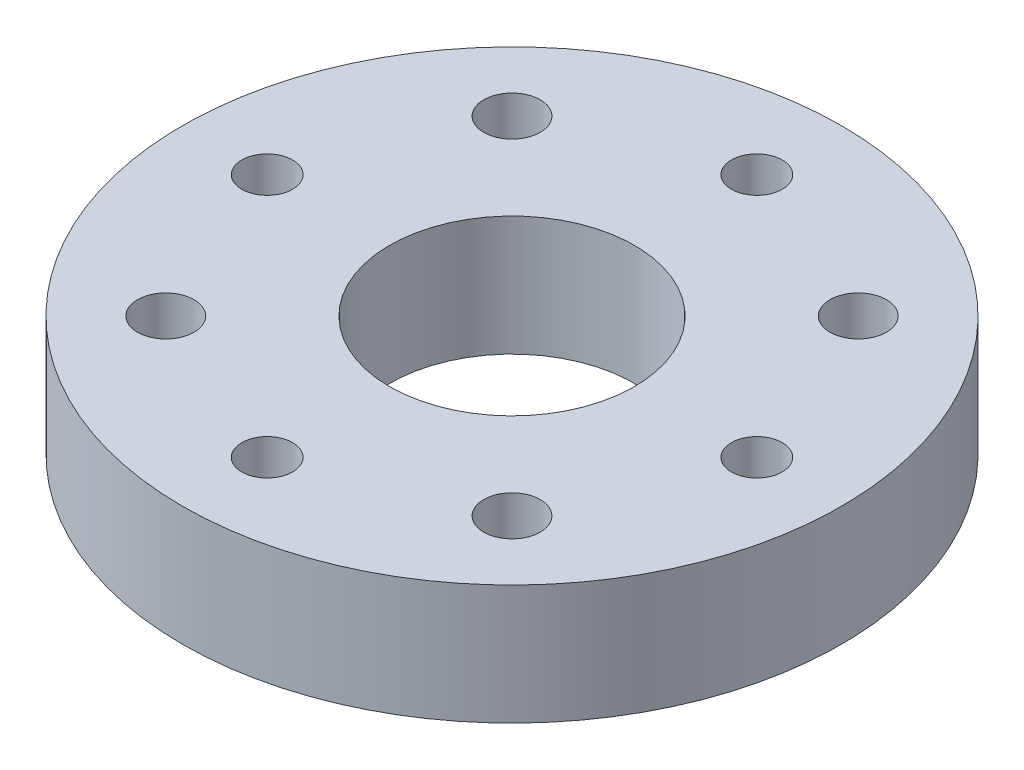
ISO-10303-21;
HEADER;
FILE_DESCRIPTION(('STEP AP214'),'2;1');
FILE_NAME('part.step','',(''),(''),'','','');
FILE_SCHEMA(('AUTOMOTIVE_DESIGN { 1 0 10303 214 1 1 1 1 }'));
ENDSEC;
DATA;
#1=APPLICATION_CONTEXT('core data for automotive mechanical design processes');
#2=APPLICATION_PROTOCOL_DEFINITION('international standard','automotive_design',2000,#1);
#3=PRODUCT_CONTEXT('',#1,'mechanical');
#4=PRODUCT('Part','Part','',(#3));
#5=PRODUCT_RELATED_PRODUCT_CATEGORY('part','',(#4));
#6=PRODUCT_DEFINITION_FORMATION('','',#4);
#7=PRODUCT_DEFINITION_CONTEXT('part definition',#1,'design');
#8=PRODUCT_DEFINITION('design','',#6,#7);
#9=PRODUCT_DEFINITION_SHAPE('','',#8);
#10=(LENGTH_UNIT() NAMED_UNIT(*) SI_UNIT(.MILLI.,.METRE.));
#11=(NAMED_UNIT(*) PLANE_ANGLE_UNIT() SI_UNIT($,.RADIAN.));
#12=(NAMED_UNIT(*) SI_UNIT($,.STERADIAN.) SOLID_ANGLE_UNIT());
#13=UNCERTAINTY_MEASURE_WITH_UNIT(LENGTH_MEASURE(1.E-05),#10,'distance_accuracy_value','');
#14=(GEOMETRIC_REPRESENTATION_CONTEXT(3) GLOBAL_UNCERTAINTY_ASSIGNED_CONTEXT((#13)) GLOBAL_UNIT_ASSIGNED_CONTEXT((#10,
#11,#12)) REPRESENTATION_CONTEXT('',''));
#15=CARTESIAN_POINT('',(0.,0.,0.));
#16=DIRECTION('',(0.,0.,1.));
#17=DIRECTION('',(1.,0.,0.));
#18=AXIS2_PLACEMENT_3D('',#15,#16,#17);
#19=CARTESIAN_POINT('',(0.,6.35,0.));
#20=DIRECTION('',(0.,1.,0.));
#21=DIRECTION('',(0.,0.,1.));
#22=AXIS2_PLACEMENT_3D('',#19,#20,#21);
#23=PLANE('',#22);
#24=CARTESIAN_POINT('',(-9.19238815542507,6.35,-9.19238815542517));
#25=DIRECTION('',(0.,1.,0.));
#26=DIRECTION('',(0.,0.,1.));
#27=AXIS2_PLACEMENT_3D('',#24,#25,#26);
#28=CIRCLE('',#27,1.5);
#29=CARTESIAN_POINT('',(-9.19238815542507,6.35,-7.69238815542517));
#30=VERTEX_POINT('',#29);
#31=EDGE_CURVE('E83',#30,#30,#28,.T.);
#32=ORIENTED_EDGE('',*,*,#31,.F.);
#33=EDGE_LOOP('',(#32));
#34=FACE_BOUND('',#33,.T.);
#35=CARTESIAN_POINT('',(-9.19238815542507,6.35,9.19238815542517));
#36=DIRECTION('',(0.,1.,0.));
#37=DIRECTION('',(0.,0.,1.));
#38=AXIS2_PLACEMENT_3D('',#35,#36,#37);
#39=CIRCLE('',#38,1.50000000000004);
#40=CARTESIAN_POINT('',(-9.19238815542507,6.35,10.6923881554252));
#41=VERTEX_POINT('',#40);
#42=EDGE_CURVE('E71',#41,#41,#39,.T.);
#43=ORIENTED_EDGE('',*,*,#42,.F.);
#44=EDGE_LOOP('',(#43));
#45=FACE_BOUND('',#44,.T.);
#46=CARTESIAN_POINT('',(9.19238815542513,6.35,9.1923881554251));
#47=DIRECTION('',(0.,1.,0.));
#48=DIRECTION('',(0.,0.,1.));
#49=AXIS2_PLACEMENT_3D('',#46,#47,#48);
#50=CIRCLE('',#49,1.5);
#51=CARTESIAN_POINT('',(9.19238815542513,6.35,10.6923881554251));
#52=VERTEX_POINT('',#51);
#53=EDGE_CURVE('E59',#52,#52,#50,.T.);
#54=ORIENTED_EDGE('',*,*,#53,.F.);
#55=EDGE_LOOP('',(#54));
#56=FACE_BOUND('',#55,.T.);
#57=CARTESIAN_POINT('',(9.19238815542507,6.35,-9.19238815542517));
#58=DIRECTION('',(0.,1.,0.));
#59=DIRECTION('',(0.,0.,1.));
#60=AXIS2_PLACEMENT_3D('',#57,#58,#59);
#61=CIRCLE('',#60,1.5);
#62=CARTESIAN_POINT('',(9.19238815542507,6.35,-7.69238815542517));
#63=VERTEX_POINT('',#62);
#64=EDGE_CURVE('E47',#63,#63,#61,.T.);
#65=ORIENTED_EDGE('',*,*,#64,.F.);
#66=EDGE_LOOP('',(#65));
#67=FACE_BOUND('',#66,.T.);
#68=CARTESIAN_POINT('',(0.,6.35,0.));
#69=DIRECTION('',(0.,1.,0.));
#70=DIRECTION('',(0.,0.,1.));
#71=AXIS2_PLACEMENT_3D('',#68,#69,#70);
#72=CIRCLE('',#71,17.5);
#73=CARTESIAN_POINT('',(0.,6.35,17.5));
#74=VERTEX_POINT('',#73);
#75=EDGE_CURVE('E10',#74,#74,#72,.T.);
#76=ORIENTED_EDGE('',*,*,#75,.T.);
#77=EDGE_LOOP('',(#76));
#78=FACE_BOUND('',#77,.T.);
#79=CARTESIAN_POINT('',(0.,6.35,0.));
#80=DIRECTION('',(0.,1.,0.));
#81=DIRECTION('',(0.,0.,1.));
#82=AXIS2_PLACEMENT_3D('',#79,#80,#81);
#83=CIRCLE('',#82,6.5);
#84=CARTESIAN_POINT('',(0.,6.35,6.5));
#85=VERTEX_POINT('',#84);
#86=EDGE_CURVE('E42',#85,#85,#83,.T.);
#87=ORIENTED_EDGE('',*,*,#86,.F.);
#88=EDGE_LOOP('',(#87));
#89=FACE_BOUND('',#88,.T.);
#90=CARTESIAN_POINT('',(0.,6.35,-13.));
#91=DIRECTION('',(0.,1.,0.));
#92=DIRECTION('',(0.,0.,1.));
#93=AXIS2_PLACEMENT_3D('',#90,#91,#92);
#94=CIRCLE('',#93,1.35);
#95=CARTESIAN_POINT('',(0.,6.35,-11.65));
#96=VERTEX_POINT('',#95);
#97=EDGE_CURVE('E53',#96,#96,#94,.T.);
#98=ORIENTED_EDGE('',*,*,#97,.F.);
#99=EDGE_LOOP('',(#98));
#100=FACE_BOUND('',#99,.T.);
#101=CARTESIAN_POINT('',(13.,6.35,0.));
#102=DIRECTION('',(0.,1.,0.));
#103=DIRECTION('',(0.,0.,1.));
#104=AXIS2_PLACEMENT_3D('',#101,#102,#103);
#105=CIRCLE('',#104,1.35);
#106=CARTESIAN_POINT('',(13.,6.35,1.35000000000005));
#107=VERTEX_POINT('',#106);
#108=EDGE_CURVE('E65',#107,#107,#105,.T.);
#109=ORIENTED_EDGE('',*,*,#108,.F.);
#110=EDGE_LOOP('',(#109));
#111=FACE_BOUND('',#110,.T.);
#112=CARTESIAN_POINT('',(0.,6.35,13.));
#113=DIRECTION('',(0.,1.,0.));
#114=DIRECTION('',(0.,0.,1.));
#115=AXIS2_PLACEMENT_3D('',#112,#113,#114);
#116=CIRCLE('',#115,1.35000000000009);
#117=CARTESIAN_POINT('',(0.,6.35,14.3500000000001));
#118=VERTEX_POINT('',#117);
#119=EDGE_CURVE('E77',#118,#118,#116,.T.);
#120=ORIENTED_EDGE('',*,*,#119,.F.);
#121=EDGE_LOOP('',(#120));
#122=FACE_BOUND('',#121,.T.);
#123=CARTESIAN_POINT('',(-13.,6.35,-1.36167772214882E-13));
#124=DIRECTION('',(0.,1.,0.));
#125=DIRECTION('',(0.,0.,1.));
#126=AXIS2_PLACEMENT_3D('',#123,#124,#125);
#127=CIRCLE('',#126,1.35);
#128=CARTESIAN_POINT('',(-13.,6.35,1.34999999999986));
#129=VERTEX_POINT('',#128);
#130=EDGE_CURVE('E89',#129,#129,#127,.T.);
#131=ORIENTED_EDGE('',*,*,#130,.F.);
#132=EDGE_LOOP('',(#131));
#133=FACE_BOUND('',#132,.T.);
#134=ADVANCED_FACE('F31',(#34,#45,#56,#67,#78,#89,#100,#111,#122,#133),#23,.T.);
#135=CARTESIAN_POINT('',(0.,0.,0.));
#136=DIRECTION('',(0.,1.,0.));
#137=DIRECTION('',(0.,0.,1.));
#138=AXIS2_PLACEMENT_3D('',#135,#136,#137);
#139=PLANE('',#138);
#140=CARTESIAN_POINT('',(-9.19238815542507,0.,-9.19238815542517));
#141=DIRECTION('',(0.,1.,0.));
#142=DIRECTION('',(0.,0.,1.));
#143=AXIS2_PLACEMENT_3D('',#140,#141,#142);
#144=CIRCLE('',#143,1.5);
#145=CARTESIAN_POINT('',(-9.19238815542507,0.,-7.69238815542517));
#146=VERTEX_POINT('',#145);
#147=EDGE_CURVE('E86',#146,#146,#144,.T.);
#148=ORIENTED_EDGE('',*,*,#147,.T.);
#149=EDGE_LOOP('',(#148));
#150=FACE_BOUND('',#149,.T.);
#151=CARTESIAN_POINT('',(-9.19238815542507,0.,9.19238815542517));
#152=DIRECTION('',(0.,1.,0.));
#153=DIRECTION('',(0.,0.,1.));
#154=AXIS2_PLACEMENT_3D('',#151,#152,#153);
#155=CIRCLE('',#154,1.50000000000004);
#156=CARTESIAN_POINT('',(-9.19238815542507,0.,10.6923881554252));
#157=VERTEX_POINT('',#156);
#158=EDGE_CURVE('E74',#157,#157,#155,.T.);
#159=ORIENTED_EDGE('',*,*,#158,.T.);
#160=EDGE_LOOP('',(#159));
#161=FACE_BOUND('',#160,.T.);
#162=CARTESIAN_POINT('',(9.19238815542513,0.,9.1923881554251));
#163=DIRECTION('',(0.,1.,0.));
#164=DIRECTION('',(0.,0.,1.));
#165=AXIS2_PLACEMENT_3D('',#162,#163,#164);
#166=CIRCLE('',#165,1.5);
#167=CARTESIAN_POINT('',(9.19238815542513,0.,10.6923881554251));
#168=VERTEX_POINT('',#167);
#169=EDGE_CURVE('E62',#168,#168,#166,.T.);
#170=ORIENTED_EDGE('',*,*,#169,.T.);
#171=EDGE_LOOP('',(#170));
#172=FACE_BOUND('',#171,.T.);
#173=CARTESIAN_POINT('',(9.19238815542507,0.,-9.19238815542517));
#174=DIRECTION('',(0.,1.,0.));
#175=DIRECTION('',(0.,0.,1.));
#176=AXIS2_PLACEMENT_3D('',#173,#174,#175);
#177=CIRCLE('',#176,1.5);
#178=CARTESIAN_POINT('',(9.19238815542507,0.,-7.69238815542517));
#179=VERTEX_POINT('',#178);
#180=EDGE_CURVE('E50',#179,#179,#177,.T.);
#181=ORIENTED_EDGE('',*,*,#180,.T.);
#182=EDGE_LOOP('',(#181));
#183=FACE_BOUND('',#182,.T.);
#184=CARTESIAN_POINT('',(0.,0.,0.));
#185=DIRECTION('',(0.,1.,0.));
#186=DIRECTION('',(0.,0.,1.));
#187=AXIS2_PLACEMENT_3D('',#184,#185,#186);
#188=CIRCLE('',#187,17.5);
#189=CARTESIAN_POINT('',(0.,0.,17.5));
#190=VERTEX_POINT('',#189);
#191=EDGE_CURVE('E35',#190,#190,#188,.T.);
#192=ORIENTED_EDGE('',*,*,#191,.F.);
#193=EDGE_LOOP('',(#192));
#194=FACE_BOUND('',#193,.T.);
#195=CARTESIAN_POINT('',(0.,0.,0.));
#196=DIRECTION('',(0.,1.,0.));
#197=DIRECTION('',(0.,0.,1.));
#198=AXIS2_PLACEMENT_3D('',#195,#196,#197);
#199=CIRCLE('',#198,6.5);
#200=CARTESIAN_POINT('',(0.,0.,6.5));
#201=VERTEX_POINT('',#200);
#202=EDGE_CURVE('E44',#201,#201,#199,.T.);
#203=ORIENTED_EDGE('',*,*,#202,.T.);
#204=EDGE_LOOP('',(#203));
#205=FACE_BOUND('',#204,.T.);
#206=CARTESIAN_POINT('',(0.,0.,-13.));
#207=DIRECTION('',(0.,1.,0.));
#208=DIRECTION('',(0.,0.,1.));
#209=AXIS2_PLACEMENT_3D('',#206,#207,#208);
#210=CIRCLE('',#209,1.35);
#211=CARTESIAN_POINT('',(0.,0.,-11.65));
#212=VERTEX_POINT('',#211);
#213=EDGE_CURVE('E56',#212,#212,#210,.T.);
#214=ORIENTED_EDGE('',*,*,#213,.T.);
#215=EDGE_LOOP('',(#214));
#216=FACE_BOUND('',#215,.T.);
#217=CARTESIAN_POINT('',(13.,0.,0.));
#218=DIRECTION('',(0.,1.,0.));
#219=DIRECTION('',(0.,0.,1.));
#220=AXIS2_PLACEMENT_3D('',#217,#218,#219);
#221=CIRCLE('',#220,1.35);
#222=CARTESIAN_POINT('',(13.,0.,1.35000000000005));
#223=VERTEX_POINT('',#222);
#224=EDGE_CURVE('E68',#223,#223,#221,.T.);
#225=ORIENTED_EDGE('',*,*,#224,.T.);
#226=EDGE_LOOP('',(#225));
#227=FACE_BOUND('',#226,.T.);
#228=CARTESIAN_POINT('',(0.,0.,13.));
#229=DIRECTION('',(0.,1.,0.));
#230=DIRECTION('',(0.,0.,1.));
#231=AXIS2_PLACEMENT_3D('',#228,#229,#230);
#232=CIRCLE('',#231,1.35000000000009);
#233=CARTESIAN_POINT('',(0.,0.,14.3500000000001));
#234=VERTEX_POINT('',#233);
#235=EDGE_CURVE('E80',#234,#234,#232,.T.);
#236=ORIENTED_EDGE('',*,*,#235,.T.);
#237=EDGE_LOOP('',(#236));
#238=FACE_BOUND('',#237,.T.);
#239=CARTESIAN_POINT('',(-13.,0.,-1.36167772214882E-13));
#240=DIRECTION('',(0.,1.,0.));
#241=DIRECTION('',(0.,0.,1.));
#242=AXIS2_PLACEMENT_3D('',#239,#240,#241);
#243=CIRCLE('',#242,1.35);
#244=CARTESIAN_POINT('',(-13.,0.,1.34999999999986));
#245=VERTEX_POINT('',#244);
#246=EDGE_CURVE('E92',#245,#245,#243,.T.);
#247=ORIENTED_EDGE('',*,*,#246,.T.);
#248=EDGE_LOOP('',(#247));
#249=FACE_BOUND('',#248,.T.);
#250=ADVANCED_FACE('F102',(#150,#161,#172,#183,#194,#205,#216,#227,#238,#249),#139,.F.);
#251=CARTESIAN_POINT('',(0.,6.35,0.));
#252=DIRECTION('',(0.,-1.,0.));
#253=DIRECTION('',(0.,0.,-1.));
#254=AXIS2_PLACEMENT_3D('',#251,#252,#253);
#255=CYLINDRICAL_SURFACE('',#254,17.5);
#256=ORIENTED_EDGE('',*,*,#75,.F.);
#257=EDGE_LOOP('',(#256));
#258=FACE_BOUND('',#257,.T.);
#259=ORIENTED_EDGE('',*,*,#191,.T.);
#260=EDGE_LOOP('',(#259));
#261=FACE_BOUND('',#260,.T.);
#262=ADVANCED_FACE('F33',(#258,#261),#255,.T.);
#263=CARTESIAN_POINT('',(0.,6.35,0.));
#264=DIRECTION('',(0.,-1.,0.));
#265=DIRECTION('',(0.,0.,-1.));
#266=AXIS2_PLACEMENT_3D('',#263,#264,#265);
#267=CYLINDRICAL_SURFACE('',#266,6.5);
#268=ORIENTED_EDGE('',*,*,#86,.T.);
#269=EDGE_LOOP('',(#268));
#270=FACE_BOUND('',#269,.T.);
#271=ORIENTED_EDGE('',*,*,#202,.F.);
#272=EDGE_LOOP('',(#271));
#273=FACE_BOUND('',#272,.T.);
#274=ADVANCED_FACE('F112',(#270,#273),#267,.F.);
#275=CARTESIAN_POINT('',(9.19238815542507,6.35,-9.19238815542517));
#276=DIRECTION('',(0.,-1.,0.));
#277=DIRECTION('',(0.,0.,-1.));
#278=AXIS2_PLACEMENT_3D('',#275,#276,#277);
#279=CYLINDRICAL_SURFACE('',#278,1.5);
#280=ORIENTED_EDGE('',*,*,#64,.T.);
#281=EDGE_LOOP('',(#280));
#282=FACE_BOUND('',#281,.T.);
#283=ORIENTED_EDGE('',*,*,#180,.F.);
#284=EDGE_LOOP('',(#283));
#285=FACE_BOUND('',#284,.T.);
#286=ADVANCED_FACE('F115',(#282,#285),#279,.F.);
#287=CARTESIAN_POINT('',(0.,6.35,-13.));
#288=DIRECTION('',(0.,-1.,0.));
#289=DIRECTION('',(0.,0.,-1.));
#290=AXIS2_PLACEMENT_3D('',#287,#288,#289);
#291=CYLINDRICAL_SURFACE('',#290,1.35);
#292=ORIENTED_EDGE('',*,*,#97,.T.);
#293=EDGE_LOOP('',(#292));
#294=FACE_BOUND('',#293,.T.);
#295=ORIENTED_EDGE('',*,*,#213,.F.);
#296=EDGE_LOOP('',(#295));
#297=FACE_BOUND('',#296,.T.);
#298=ADVANCED_FACE('F119',(#294,#297),#291,.F.);
#299=CARTESIAN_POINT('',(9.19238815542513,6.35,9.1923881554251));
#300=DIRECTION('',(0.,-1.,0.));
#301=DIRECTION('',(0.,0.,-1.));
#302=AXIS2_PLACEMENT_3D('',#299,#300,#301);
#303=CYLINDRICAL_SURFACE('',#302,1.5);
#304=ORIENTED_EDGE('',*,*,#53,.T.);
#305=EDGE_LOOP('',(#304));
#306=FACE_BOUND('',#305,.T.);
#307=ORIENTED_EDGE('',*,*,#169,.F.);
#308=EDGE_LOOP('',(#307));
#309=FACE_BOUND('',#308,.T.);
#310=ADVANCED_FACE('F123',(#306,#309),#303,.F.);
#311=CARTESIAN_POINT('',(13.,6.35,0.));
#312=DIRECTION('',(0.,-1.,0.));
#313=DIRECTION('',(0.,0.,-1.));
#314=AXIS2_PLACEMENT_3D('',#311,#312,#313);
#315=CYLINDRICAL_SURFACE('',#314,1.35);
#316=ORIENTED_EDGE('',*,*,#108,.T.);
#317=EDGE_LOOP('',(#316));
#318=FACE_BOUND('',#317,.T.);
#319=ORIENTED_EDGE('',*,*,#224,.F.);
#320=EDGE_LOOP('',(#319));
#321=FACE_BOUND('',#320,.T.);
#322=ADVANCED_FACE('F127',(#318,#321),#315,.F.);
#323=CARTESIAN_POINT('',(-9.19238815542507,6.35,9.19238815542517));
#324=DIRECTION('',(0.,-1.,0.));
#325=DIRECTION('',(0.,0.,-1.));
#326=AXIS2_PLACEMENT_3D('',#323,#324,#325);
#327=CYLINDRICAL_SURFACE('',#326,1.50000000000004);
#328=ORIENTED_EDGE('',*,*,#42,.T.);
#329=EDGE_LOOP('',(#328));
#330=FACE_BOUND('',#329,.T.);
#331=ORIENTED_EDGE('',*,*,#158,.F.);
#332=EDGE_LOOP('',(#331));
#333=FACE_BOUND('',#332,.T.);
#334=ADVANCED_FACE('F131',(#330,#333),#327,.F.);
#335=CARTESIAN_POINT('',(0.,6.35,13.));
#336=DIRECTION('',(0.,-1.,0.));
#337=DIRECTION('',(0.,0.,-1.));
#338=AXIS2_PLACEMENT_3D('',#335,#336,#337);
#339=CYLINDRICAL_SURFACE('',#338,1.35000000000009);
#340=ORIENTED_EDGE('',*,*,#119,.T.);
#341=EDGE_LOOP('',(#340));
#342=FACE_BOUND('',#341,.T.);
#343=ORIENTED_EDGE('',*,*,#235,.F.);
#344=EDGE_LOOP('',(#343));
#345=FACE_BOUND('',#344,.T.);
#346=ADVANCED_FACE('F135',(#342,#345),#339,.F.);
#347=CARTESIAN_POINT('',(-9.19238815542507,6.35,-9.19238815542517));
#348=DIRECTION('',(0.,-1.,0.));
#349=DIRECTION('',(0.,0.,-1.));
#350=AXIS2_PLACEMENT_3D('',#347,#348,#349);
#351=CYLINDRICAL_SURFACE('',#350,1.5);
#352=ORIENTED_EDGE('',*,*,#31,.T.);
#353=EDGE_LOOP('',(#352));
#354=FACE_BOUND('',#353,.T.);
#355=ORIENTED_EDGE('',*,*,#147,.F.);
#356=EDGE_LOOP('',(#355));
#357=FACE_BOUND('',#356,.T.);
#358=ADVANCED_FACE('F139',(#354,#357),#351,.F.);
#359=CARTESIAN_POINT('',(-13.,6.35,-1.36167772214882E-13));
#360=DIRECTION('',(0.,-1.,0.));
#361=DIRECTION('',(0.,0.,-1.));
#362=AXIS2_PLACEMENT_3D('',#359,#360,#361);
#363=CYLINDRICAL_SURFACE('',#362,1.35);
#364=ORIENTED_EDGE('',*,*,#130,.T.);
#365=EDGE_LOOP('',(#364));
#366=FACE_BOUND('',#365,.T.);
#367=ORIENTED_EDGE('',*,*,#246,.F.);
#368=EDGE_LOOP('',(#367));
#369=FACE_BOUND('',#368,.T.);
#370=ADVANCED_FACE('F98',(#366,#369),#363,.F.);
#371=CLOSED_SHELL('',(#134,#250,#262,#274,#286,#298,#310,#322,#334,#346,#358,#370));
#372=MANIFOLD_SOLID_BREP('B2',#371);
#373=ADVANCED_BREP_SHAPE_REPRESENTATION('',(#18,#372),#14);
#374=SHAPE_DEFINITION_REPRESENTATION(#9,#373);
ENDSEC;
END-ISO-10303-21;
